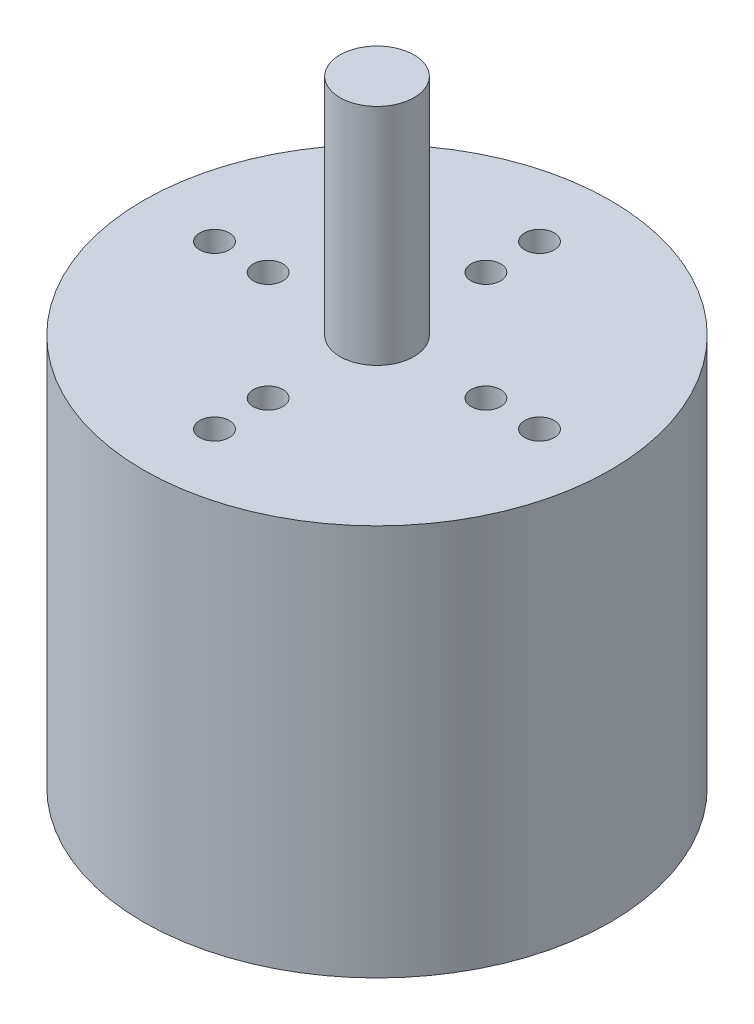
ISO-10303-21;
HEADER;
FILE_DESCRIPTION(('STEP AP214'),'2;1');
FILE_NAME('part.step','',(''),(''),'','','');
FILE_SCHEMA(('AUTOMOTIVE_DESIGN { 1 0 10303 214 1 1 1 1 }'));
ENDSEC;
DATA;
#1=APPLICATION_CONTEXT('core data for automotive mechanical design processes');
#2=APPLICATION_PROTOCOL_DEFINITION('international standard','automotive_design',2000,#1);
#3=PRODUCT_CONTEXT('',#1,'mechanical');
#4=PRODUCT('Part','Part','',(#3));
#5=PRODUCT_RELATED_PRODUCT_CATEGORY('part','',(#4));
#6=PRODUCT_DEFINITION_FORMATION('','',#4);
#7=PRODUCT_DEFINITION_CONTEXT('part definition',#1,'design');
#8=PRODUCT_DEFINITION('design','',#6,#7);
#9=PRODUCT_DEFINITION_SHAPE('','',#8);
#10=(LENGTH_UNIT() NAMED_UNIT(*) SI_UNIT(.MILLI.,.METRE.));
#11=(NAMED_UNIT(*) PLANE_ANGLE_UNIT() SI_UNIT($,.RADIAN.));
#12=(NAMED_UNIT(*) SI_UNIT($,.STERADIAN.) SOLID_ANGLE_UNIT());
#13=UNCERTAINTY_MEASURE_WITH_UNIT(LENGTH_MEASURE(1.E-05),#10,'distance_accuracy_value','');
#14=(GEOMETRIC_REPRESENTATION_CONTEXT(3) GLOBAL_UNCERTAINTY_ASSIGNED_CONTEXT((#13)) GLOBAL_UNIT_ASSIGNED_CONTEXT((#10,
#11,#12)) REPRESENTATION_CONTEXT('',''));
#15=CARTESIAN_POINT('',(0.,0.,0.));
#16=DIRECTION('',(0.,0.,1.));
#17=DIRECTION('',(1.,0.,0.));
#18=AXIS2_PLACEMENT_3D('',#15,#16,#17);
#19=CARTESIAN_POINT('',(0.,52.86,0.));
#20=DIRECTION('',(0.,-1.,0.));
#21=DIRECTION('',(0.,0.,-1.));
#22=AXIS2_PLACEMENT_3D('',#19,#20,#21);
#23=CYLINDRICAL_SURFACE('',#22,31.525);
#24=CARTESIAN_POINT('',(0.,52.86,0.));
#25=DIRECTION('',(0.,1.,0.));
#26=DIRECTION('',(0.,0.,1.));
#27=AXIS2_PLACEMENT_3D('',#24,#25,#26);
#28=CIRCLE('',#27,31.525);
#29=CARTESIAN_POINT('',(0.,52.86,31.525));
#30=VERTEX_POINT('',#29);
#31=EDGE_CURVE('E38',#30,#30,#28,.T.);
#32=ORIENTED_EDGE('',*,*,#31,.F.);
#33=EDGE_LOOP('',(#32));
#34=FACE_BOUND('',#33,.T.);
#35=CARTESIAN_POINT('',(0.,0.,0.));
#36=DIRECTION('',(0.,1.,0.));
#37=DIRECTION('',(0.,0.,1.));
#38=AXIS2_PLACEMENT_3D('',#35,#36,#37);
#39=CIRCLE('',#38,31.525);
#40=CARTESIAN_POINT('',(0.,0.,31.525));
#41=VERTEX_POINT('',#40);
#42=EDGE_CURVE('E34',#41,#41,#39,.T.);
#43=ORIENTED_EDGE('',*,*,#42,.T.);
#44=EDGE_LOOP('',(#43));
#45=FACE_BOUND('',#44,.T.);
#46=ADVANCED_FACE('F31',(#34,#45),#23,.T.);
#47=CARTESIAN_POINT('',(0.,52.86,0.));
#48=DIRECTION('',(0.,1.,0.));
#49=DIRECTION('',(0.,0.,1.));
#50=AXIS2_PLACEMENT_3D('',#47,#48,#49);
#51=PLANE('',#50);
#52=CARTESIAN_POINT('',(21.94,52.86,-2.29809301722655E-13));
#53=DIRECTION('',(0.,1.,0.));
#54=DIRECTION('',(-1.,0.,0.));
#55=AXIS2_PLACEMENT_3D('',#52,#53,#54);
#56=CIRCLE('',#55,2.);
#57=CARTESIAN_POINT('',(19.94,52.86,-2.08860413689596E-13));
#58=VERTEX_POINT('',#57);
#59=EDGE_CURVE('E66',#58,#58,#56,.T.);
#60=ORIENTED_EDGE('',*,*,#59,.F.);
#61=EDGE_LOOP('',(#60));
#62=FACE_BOUND('',#61,.T.);
#63=CARTESIAN_POINT('',(-21.94,52.86,0.));
#64=DIRECTION('',(0.,1.,0.));
#65=DIRECTION('',(1.,0.,0.));
#66=AXIS2_PLACEMENT_3D('',#63,#64,#65);
#67=CIRCLE('',#66,2.);
#68=CARTESIAN_POINT('',(-19.94,52.86,0.));
#69=VERTEX_POINT('',#68);
#70=EDGE_CURVE('E80',#69,#69,#67,.T.);
#71=ORIENTED_EDGE('',*,*,#70,.F.);
#72=EDGE_LOOP('',(#71));
#73=FACE_BOUND('',#72,.T.);
#74=CARTESIAN_POINT('',(0.,52.86,14.7));
#75=DIRECTION('',(0.,1.,0.));
#76=DIRECTION('',(0.,0.,-1.));
#77=AXIS2_PLACEMENT_3D('',#74,#75,#76);
#78=CIRCLE('',#77,2.);
#79=CARTESIAN_POINT('',(0.,52.86,12.7));
#80=VERTEX_POINT('',#79);
#81=EDGE_CURVE('E73',#80,#80,#78,.T.);
#82=ORIENTED_EDGE('',*,*,#81,.F.);
#83=EDGE_LOOP('',(#82));
#84=FACE_BOUND('',#83,.T.);
#85=CARTESIAN_POINT('',(0.,52.86,21.94));
#86=DIRECTION('',(0.,1.,0.));
#87=DIRECTION('',(0.,0.,-1.));
#88=AXIS2_PLACEMENT_3D('',#85,#86,#87);
#89=CIRCLE('',#88,2.);
#90=CARTESIAN_POINT('',(0.,52.86,19.94));
#91=VERTEX_POINT('',#90);
#92=EDGE_CURVE('E90',#91,#91,#89,.T.);
#93=ORIENTED_EDGE('',*,*,#92,.F.);
#94=EDGE_LOOP('',(#93));
#95=FACE_BOUND('',#94,.T.);
#96=CARTESIAN_POINT('',(14.7,52.86,-1.53974327042982E-13));
#97=DIRECTION('',(0.,1.,0.));
#98=DIRECTION('',(-1.,0.,0.));
#99=AXIS2_PLACEMENT_3D('',#96,#97,#98);
#100=CIRCLE('',#99,2.);
#101=CARTESIAN_POINT('',(12.7,52.86,-1.33025439009923E-13));
#102=VERTEX_POINT('',#101);
#103=EDGE_CURVE('E72',#102,#102,#100,.T.);
#104=ORIENTED_EDGE('',*,*,#103,.F.);
#105=EDGE_LOOP('',(#104));
#106=FACE_BOUND('',#105,.T.);
#107=CARTESIAN_POINT('',(-14.7,52.86,0.));
#108=DIRECTION('',(0.,1.,0.));
#109=DIRECTION('',(1.,0.,0.));
#110=AXIS2_PLACEMENT_3D('',#107,#108,#109);
#111=CIRCLE('',#110,2.);
#112=CARTESIAN_POINT('',(-12.7,52.86,0.));
#113=VERTEX_POINT('',#112);
#114=EDGE_CURVE('E60',#113,#113,#111,.T.);
#115=ORIENTED_EDGE('',*,*,#114,.F.);
#116=EDGE_LOOP('',(#115));
#117=FACE_BOUND('',#116,.T.);
#118=CARTESIAN_POINT('',(0.,52.86,-14.7));
#119=DIRECTION('',(0.,1.,0.));
#120=DIRECTION('',(0.,0.,1.));
#121=AXIS2_PLACEMENT_3D('',#118,#119,#120);
#122=CIRCLE('',#121,2.);
#123=CARTESIAN_POINT('',(0.,52.86,-12.7));
#124=VERTEX_POINT('',#123);
#125=EDGE_CURVE('E55',#124,#124,#122,.T.);
#126=ORIENTED_EDGE('',*,*,#125,.F.);
#127=EDGE_LOOP('',(#126));
#128=FACE_BOUND('',#127,.T.);
#129=CARTESIAN_POINT('',(0.,52.86,-21.94));
#130=DIRECTION('',(0.,1.,0.));
#131=DIRECTION('',(0.,0.,1.));
#132=AXIS2_PLACEMENT_3D('',#129,#130,#131);
#133=CIRCLE('',#132,2.);
#134=CARTESIAN_POINT('',(0.,52.86,-19.94));
#135=VERTEX_POINT('',#134);
#136=EDGE_CURVE('E48',#135,#135,#133,.T.);
#137=ORIENTED_EDGE('',*,*,#136,.F.);
#138=EDGE_LOOP('',(#137));
#139=FACE_BOUND('',#138,.T.);
#140=CARTESIAN_POINT('',(0.,52.86,0.));
#141=DIRECTION('',(0.,1.,0.));
#142=DIRECTION('',(0.,0.,1.));
#143=AXIS2_PLACEMENT_3D('',#140,#141,#142);
#144=CIRCLE('',#143,5.);
#145=CARTESIAN_POINT('',(0.,52.86,5.));
#146=VERTEX_POINT('',#145);
#147=EDGE_CURVE('E10',#146,#146,#144,.T.);
#148=ORIENTED_EDGE('',*,*,#147,.F.);
#149=EDGE_LOOP('',(#148));
#150=FACE_BOUND('',#149,.T.);
#151=ORIENTED_EDGE('',*,*,#31,.T.);
#152=EDGE_LOOP('',(#151));
#153=FACE_BOUND('',#152,.T.);
#154=ADVANCED_FACE('F105',(#62,#73,#84,#95,#106,#117,#128,#139,#150,#153),#51,.T.);
#155=CARTESIAN_POINT('',(0.,0.,0.));
#156=DIRECTION('',(0.,1.,0.));
#157=DIRECTION('',(0.,0.,1.));
#158=AXIS2_PLACEMENT_3D('',#155,#156,#157);
#159=PLANE('',#158);
#160=ORIENTED_EDGE('',*,*,#42,.F.);
#161=EDGE_LOOP('',(#160));
#162=FACE_BOUND('',#161,.T.);
#163=ADVANCED_FACE('F108',(#162),#159,.F.);
#164=CARTESIAN_POINT('',(0.,83.14,0.));
#165=DIRECTION('',(0.,-1.,0.));
#166=DIRECTION('',(0.,0.,-1.));
#167=AXIS2_PLACEMENT_3D('',#164,#165,#166);
#168=CYLINDRICAL_SURFACE('',#167,5.);
#169=CARTESIAN_POINT('',(0.,83.14,0.));
#170=DIRECTION('',(0.,1.,0.));
#171=DIRECTION('',(0.,0.,1.));
#172=AXIS2_PLACEMENT_3D('',#169,#170,#171);
#173=CIRCLE('',#172,5.);
#174=CARTESIAN_POINT('',(0.,83.14,5.));
#175=VERTEX_POINT('',#174);
#176=EDGE_CURVE('E44',#175,#175,#173,.T.);
#177=ORIENTED_EDGE('',*,*,#176,.F.);
#178=EDGE_LOOP('',(#177));
#179=FACE_BOUND('',#178,.T.);
#180=ORIENTED_EDGE('',*,*,#147,.T.);
#181=EDGE_LOOP('',(#180));
#182=FACE_BOUND('',#181,.T.);
#183=ADVANCED_FACE('F128',(#179,#182),#168,.T.);
#184=CARTESIAN_POINT('',(0.,83.14,0.));
#185=DIRECTION('',(0.,1.,0.));
#186=DIRECTION('',(0.,0.,1.));
#187=AXIS2_PLACEMENT_3D('',#184,#185,#186);
#188=PLANE('',#187);
#189=ORIENTED_EDGE('',*,*,#176,.T.);
#190=EDGE_LOOP('',(#189));
#191=FACE_BOUND('',#190,.T.);
#192=ADVANCED_FACE('F132',(#191),#188,.T.);
#193=CARTESIAN_POINT('',(0.,49.86,-21.94));
#194=DIRECTION('',(0.,1.,0.));
#195=DIRECTION('',(0.,0.,1.));
#196=AXIS2_PLACEMENT_3D('',#193,#194,#195);
#197=CYLINDRICAL_SURFACE('',#196,2.);
#198=CARTESIAN_POINT('',(0.,49.86,-21.94));
#199=DIRECTION('',(0.,1.,0.));
#200=DIRECTION('',(0.,0.,1.));
#201=AXIS2_PLACEMENT_3D('',#198,#199,#200);
#202=CIRCLE('',#201,2.);
#203=CARTESIAN_POINT('',(0.,49.86,-19.94));
#204=VERTEX_POINT('',#203);
#205=EDGE_CURVE('E51',#204,#204,#202,.T.);
#206=ORIENTED_EDGE('',*,*,#205,.F.);
#207=EDGE_LOOP('',(#206));
#208=FACE_BOUND('',#207,.T.);
#209=ORIENTED_EDGE('',*,*,#136,.T.);
#210=EDGE_LOOP('',(#209));
#211=FACE_BOUND('',#210,.T.);
#212=ADVANCED_FACE('F138',(#208,#211),#197,.F.);
#213=CARTESIAN_POINT('',(0.,49.86,-21.94));
#214=DIRECTION('',(0.,1.,0.));
#215=DIRECTION('',(0.,0.,1.));
#216=AXIS2_PLACEMENT_3D('',#213,#214,#215);
#217=PLANE('',#216);
#218=ORIENTED_EDGE('',*,*,#205,.T.);
#219=EDGE_LOOP('',(#218));
#220=FACE_BOUND('',#219,.T.);
#221=ADVANCED_FACE('F142',(#220),#217,.T.);
#222=CARTESIAN_POINT('',(0.,49.86,-14.7));
#223=DIRECTION('',(0.,1.,0.));
#224=DIRECTION('',(0.,0.,1.));
#225=AXIS2_PLACEMENT_3D('',#222,#223,#224);
#226=CYLINDRICAL_SURFACE('',#225,2.);
#227=CARTESIAN_POINT('',(0.,49.86,-14.7));
#228=DIRECTION('',(0.,1.,0.));
#229=DIRECTION('',(0.,0.,1.));
#230=AXIS2_PLACEMENT_3D('',#227,#228,#229);
#231=CIRCLE('',#230,2.);
#232=CARTESIAN_POINT('',(0.,49.86,-12.7));
#233=VERTEX_POINT('',#232);
#234=EDGE_CURVE('E47',#233,#233,#231,.T.);
#235=ORIENTED_EDGE('',*,*,#234,.F.);
#236=EDGE_LOOP('',(#235));
#237=FACE_BOUND('',#236,.T.);
#238=ORIENTED_EDGE('',*,*,#125,.T.);
#239=EDGE_LOOP('',(#238));
#240=FACE_BOUND('',#239,.T.);
#241=ADVANCED_FACE('F146',(#237,#240),#226,.F.);
#242=CARTESIAN_POINT('',(0.,49.86,-14.7));
#243=DIRECTION('',(0.,1.,0.));
#244=DIRECTION('',(0.,0.,1.));
#245=AXIS2_PLACEMENT_3D('',#242,#243,#244);
#246=PLANE('',#245);
#247=ORIENTED_EDGE('',*,*,#234,.T.);
#248=EDGE_LOOP('',(#247));
#249=FACE_BOUND('',#248,.T.);
#250=ADVANCED_FACE('F150',(#249),#246,.T.);
#251=CARTESIAN_POINT('',(-14.7,49.86,0.));
#252=DIRECTION('',(0.,1.,0.));
#253=DIRECTION('',(0.,0.,1.));
#254=AXIS2_PLACEMENT_3D('',#251,#252,#253);
#255=CYLINDRICAL_SURFACE('',#254,2.);
#256=CARTESIAN_POINT('',(-14.7,49.86,0.));
#257=DIRECTION('',(0.,1.,0.));
#258=DIRECTION('',(1.,0.,0.));
#259=AXIS2_PLACEMENT_3D('',#256,#257,#258);
#260=CIRCLE('',#259,2.);
#261=CARTESIAN_POINT('',(-12.7,49.86,0.));
#262=VERTEX_POINT('',#261);
#263=EDGE_CURVE('E52',#262,#262,#260,.T.);
#264=ORIENTED_EDGE('',*,*,#263,.F.);
#265=EDGE_LOOP('',(#264));
#266=FACE_BOUND('',#265,.T.);
#267=ORIENTED_EDGE('',*,*,#114,.T.);
#268=EDGE_LOOP('',(#267));
#269=FACE_BOUND('',#268,.T.);
#270=ADVANCED_FACE('F154',(#266,#269),#255,.F.);
#271=CARTESIAN_POINT('',(-14.7,49.86,0.));
#272=DIRECTION('',(0.,1.,0.));
#273=DIRECTION('',(1.,0.,0.));
#274=AXIS2_PLACEMENT_3D('',#271,#272,#273);
#275=PLANE('',#274);
#276=ORIENTED_EDGE('',*,*,#263,.T.);
#277=EDGE_LOOP('',(#276));
#278=FACE_BOUND('',#277,.T.);
#279=ADVANCED_FACE('F158',(#278),#275,.T.);
#280=CARTESIAN_POINT('',(14.7,49.86,-1.53974327042982E-13));
#281=DIRECTION('',(0.,1.,0.));
#282=DIRECTION('',(0.,0.,1.));
#283=AXIS2_PLACEMENT_3D('',#280,#281,#282);
#284=CYLINDRICAL_SURFACE('',#283,2.);
#285=CARTESIAN_POINT('',(14.7,49.86,-1.53974327042982E-13));
#286=DIRECTION('',(0.,1.,0.));
#287=DIRECTION('',(-1.,0.,0.));
#288=AXIS2_PLACEMENT_3D('',#285,#286,#287);
#289=CIRCLE('',#288,2.);
#290=CARTESIAN_POINT('',(12.7,49.86,-1.33025439009923E-13));
#291=VERTEX_POINT('',#290);
#292=EDGE_CURVE('E87',#291,#291,#289,.T.);
#293=ORIENTED_EDGE('',*,*,#292,.F.);
#294=EDGE_LOOP('',(#293));
#295=FACE_BOUND('',#294,.T.);
#296=ORIENTED_EDGE('',*,*,#103,.T.);
#297=EDGE_LOOP('',(#296));
#298=FACE_BOUND('',#297,.T.);
#299=ADVANCED_FACE('F162',(#295,#298),#284,.F.);
#300=CARTESIAN_POINT('',(14.7,49.86,-1.53974327042982E-13));
#301=DIRECTION('',(0.,1.,0.));
#302=DIRECTION('',(-1.,0.,0.));
#303=AXIS2_PLACEMENT_3D('',#300,#301,#302);
#304=PLANE('',#303);
#305=ORIENTED_EDGE('',*,*,#292,.T.);
#306=EDGE_LOOP('',(#305));
#307=FACE_BOUND('',#306,.T.);
#308=ADVANCED_FACE('F101',(#307),#304,.T.);
#309=CARTESIAN_POINT('',(0.,49.86,21.94));
#310=DIRECTION('',(0.,1.,0.));
#311=DIRECTION('',(0.,0.,1.));
#312=AXIS2_PLACEMENT_3D('',#309,#310,#311);
#313=CYLINDRICAL_SURFACE('',#312,2.);
#314=CARTESIAN_POINT('',(0.,49.86,21.94));
#315=DIRECTION('',(0.,1.,0.));
#316=DIRECTION('',(0.,0.,-1.));
#317=AXIS2_PLACEMENT_3D('',#314,#315,#316);
#318=CIRCLE('',#317,2.);
#319=CARTESIAN_POINT('',(0.,49.86,19.94));
#320=VERTEX_POINT('',#319);
#321=EDGE_CURVE('E77',#320,#320,#318,.T.);
#322=ORIENTED_EDGE('',*,*,#321,.F.);
#323=EDGE_LOOP('',(#322));
#324=FACE_BOUND('',#323,.T.);
#325=ORIENTED_EDGE('',*,*,#92,.T.);
#326=EDGE_LOOP('',(#325));
#327=FACE_BOUND('',#326,.T.);
#328=ADVANCED_FACE('F98',(#324,#327),#313,.F.);
#329=CARTESIAN_POINT('',(0.,49.86,21.94));
#330=DIRECTION('',(0.,1.,0.));
#331=DIRECTION('',(0.,0.,-1.));
#332=AXIS2_PLACEMENT_3D('',#329,#330,#331);
#333=PLANE('',#332);
#334=ORIENTED_EDGE('',*,*,#321,.T.);
#335=EDGE_LOOP('',(#334));
#336=FACE_BOUND('',#335,.T.);
#337=ADVANCED_FACE('F96',(#336),#333,.T.);
#338=CARTESIAN_POINT('',(0.,49.86,14.7));
#339=DIRECTION('',(0.,1.,0.));
#340=DIRECTION('',(0.,0.,1.));
#341=AXIS2_PLACEMENT_3D('',#338,#339,#340);
#342=CYLINDRICAL_SURFACE('',#341,2.);
#343=CARTESIAN_POINT('',(0.,49.86,14.7));
#344=DIRECTION('',(0.,1.,0.));
#345=DIRECTION('',(0.,0.,-1.));
#346=AXIS2_PLACEMENT_3D('',#343,#344,#345);
#347=CIRCLE('',#346,2.);
#348=CARTESIAN_POINT('',(0.,49.86,12.7));
#349=VERTEX_POINT('',#348);
#350=EDGE_CURVE('E76',#349,#349,#347,.T.);
#351=ORIENTED_EDGE('',*,*,#350,.F.);
#352=EDGE_LOOP('',(#351));
#353=FACE_BOUND('',#352,.T.);
#354=ORIENTED_EDGE('',*,*,#81,.T.);
#355=EDGE_LOOP('',(#354));
#356=FACE_BOUND('',#355,.T.);
#357=ADVANCED_FACE('F173',(#353,#356),#342,.F.);
#358=CARTESIAN_POINT('',(0.,49.86,14.7));
#359=DIRECTION('',(0.,1.,0.));
#360=DIRECTION('',(0.,0.,-1.));
#361=AXIS2_PLACEMENT_3D('',#358,#359,#360);
#362=PLANE('',#361);
#363=ORIENTED_EDGE('',*,*,#350,.T.);
#364=EDGE_LOOP('',(#363));
#365=FACE_BOUND('',#364,.T.);
#366=ADVANCED_FACE('F176',(#365),#362,.T.);
#367=CARTESIAN_POINT('',(-21.94,49.86,0.));
#368=DIRECTION('',(0.,1.,0.));
#369=DIRECTION('',(0.,0.,1.));
#370=AXIS2_PLACEMENT_3D('',#367,#368,#369);
#371=CYLINDRICAL_SURFACE('',#370,2.);
#372=CARTESIAN_POINT('',(-21.94,49.86,0.));
#373=DIRECTION('',(0.,1.,0.));
#374=DIRECTION('',(1.,0.,0.));
#375=AXIS2_PLACEMENT_3D('',#372,#373,#374);
#376=CIRCLE('',#375,2.);
#377=CARTESIAN_POINT('',(-19.94,49.86,0.));
#378=VERTEX_POINT('',#377);
#379=EDGE_CURVE('E63',#378,#378,#376,.T.);
#380=ORIENTED_EDGE('',*,*,#379,.F.);
#381=EDGE_LOOP('',(#380));
#382=FACE_BOUND('',#381,.T.);
#383=ORIENTED_EDGE('',*,*,#70,.T.);
#384=EDGE_LOOP('',(#383));
#385=FACE_BOUND('',#384,.T.);
#386=ADVANCED_FACE('F180',(#382,#385),#371,.F.);
#387=CARTESIAN_POINT('',(-21.94,49.86,0.));
#388=DIRECTION('',(0.,1.,0.));
#389=DIRECTION('',(1.,0.,0.));
#390=AXIS2_PLACEMENT_3D('',#387,#388,#389);
#391=PLANE('',#390);
#392=ORIENTED_EDGE('',*,*,#379,.T.);
#393=EDGE_LOOP('',(#392));
#394=FACE_BOUND('',#393,.T.);
#395=ADVANCED_FACE('F168',(#394),#391,.T.);
#396=CARTESIAN_POINT('',(21.94,49.86,-2.29809301722655E-13));
#397=DIRECTION('',(0.,1.,0.));
#398=DIRECTION('',(0.,0.,1.));
#399=AXIS2_PLACEMENT_3D('',#396,#397,#398);
#400=CYLINDRICAL_SURFACE('',#399,2.);
#401=CARTESIAN_POINT('',(21.94,49.86,-2.29809301722655E-13));
#402=DIRECTION('',(0.,1.,0.));
#403=DIRECTION('',(-1.,0.,0.));
#404=AXIS2_PLACEMENT_3D('',#401,#402,#403);
#405=CIRCLE('',#404,2.);
#406=CARTESIAN_POINT('',(19.94,49.86,-2.08860413689596E-13));
#407=VERTEX_POINT('',#406);
#408=EDGE_CURVE('E69',#407,#407,#405,.T.);
#409=ORIENTED_EDGE('',*,*,#408,.F.);
#410=EDGE_LOOP('',(#409));
#411=FACE_BOUND('',#410,.T.);
#412=ORIENTED_EDGE('',*,*,#59,.T.);
#413=EDGE_LOOP('',(#412));
#414=FACE_BOUND('',#413,.T.);
#415=ADVANCED_FACE('F164',(#411,#414),#400,.F.);
#416=CARTESIAN_POINT('',(21.94,49.86,-2.29809301722655E-13));
#417=DIRECTION('',(0.,1.,0.));
#418=DIRECTION('',(-1.,0.,0.));
#419=AXIS2_PLACEMENT_3D('',#416,#417,#418);
#420=PLANE('',#419);
#421=ORIENTED_EDGE('',*,*,#408,.T.);
#422=EDGE_LOOP('',(#421));
#423=FACE_BOUND('',#422,.T.);
#424=ADVANCED_FACE('F167',(#423),#420,.T.);
#425=CLOSED_SHELL('',(#46,#154,#163,#183,#192,#212,#221,#241,#250,#270,#279,#299,#308,#328,#337,
#357,#366,#386,#395,#415,#424));
#426=MANIFOLD_SOLID_BREP('B2',#425);
#427=ADVANCED_BREP_SHAPE_REPRESENTATION('',(#18,#426),#14);
#428=SHAPE_DEFINITION_REPRESENTATION(#9,#427);
ENDSEC;
END-ISO-10303-21;
